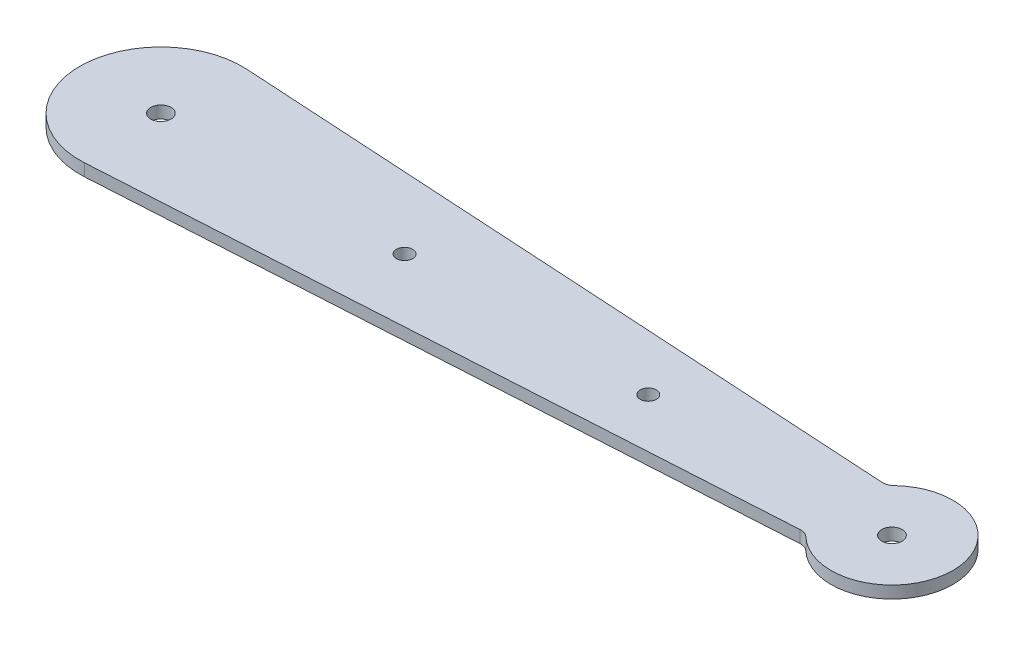
ISO-10303-21;
HEADER;
FILE_DESCRIPTION(('STEP AP214'),'2;1');
FILE_NAME('part.step','',(''),(''),'','','');
FILE_SCHEMA(('AUTOMOTIVE_DESIGN { 1 0 10303 214 1 1 1 1 }'));
ENDSEC;
DATA;
#1=APPLICATION_CONTEXT('core data for automotive mechanical design processes');
#2=APPLICATION_PROTOCOL_DEFINITION('international standard','automotive_design',2000,#1);
#3=PRODUCT_CONTEXT('',#1,'mechanical');
#4=PRODUCT('Part','Part','',(#3));
#5=PRODUCT_RELATED_PRODUCT_CATEGORY('part','',(#4));
#6=PRODUCT_DEFINITION_FORMATION('','',#4);
#7=PRODUCT_DEFINITION_CONTEXT('part definition',#1,'design');
#8=PRODUCT_DEFINITION('design','',#6,#7);
#9=PRODUCT_DEFINITION_SHAPE('','',#8);
#10=(LENGTH_UNIT() NAMED_UNIT(*) SI_UNIT(.MILLI.,.METRE.));
#11=(NAMED_UNIT(*) PLANE_ANGLE_UNIT() SI_UNIT($,.RADIAN.));
#12=(NAMED_UNIT(*) SI_UNIT($,.STERADIAN.) SOLID_ANGLE_UNIT());
#13=UNCERTAINTY_MEASURE_WITH_UNIT(LENGTH_MEASURE(1.E-05),#10,'distance_accuracy_value','');
#14=(GEOMETRIC_REPRESENTATION_CONTEXT(3) GLOBAL_UNCERTAINTY_ASSIGNED_CONTEXT((#13)) GLOBAL_UNIT_ASSIGNED_CONTEXT((#10,
#11,#12)) REPRESENTATION_CONTEXT('',''));
#15=CARTESIAN_POINT('',(0.,0.,0.));
#16=DIRECTION('',(0.,0.,1.));
#17=DIRECTION('',(1.,0.,0.));
#18=AXIS2_PLACEMENT_3D('',#15,#16,#17);
#19=CARTESIAN_POINT('',(167.629963347197,3.,13.076015953199));
#20=DIRECTION('',(0.,-1.,0.));
#21=DIRECTION('',(0.,0.,-1.));
#22=AXIS2_PLACEMENT_3D('',#19,#20,#21);
#23=CYLINDRICAL_SURFACE('',#22,3.);
#24=DIRECTION('',(0.,-1.,0.));
#25=VECTOR('',#24,1.);
#26=CARTESIAN_POINT('',(167.451945789046,3.,10.0813023193118));
#27=LINE('',#26,#25);
#28=CARTESIAN_POINT('',(167.451945789046,0.,10.0813023193118));
#29=VERTEX_POINT('',#28);
#30=CARTESIAN_POINT('',(167.451945789046,3.,10.0813023193118));
#31=VERTEX_POINT('',#30);
#32=EDGE_CURVE('E124',#29,#31,#27,.F.);
#33=ORIENTED_EDGE('',*,*,#32,.F.);
#34=CARTESIAN_POINT('',(167.629963347197,0.,13.076015953199));
#35=DIRECTION('',(0.,1.,0.));
#36=DIRECTION('',(0.,0.,1.));
#37=AXIS2_PLACEMENT_3D('',#34,#35,#36);
#38=CIRCLE('',#37,3.);
#39=CARTESIAN_POINT('',(169.691636122664,0.,10.8966799609992));
#40=VERTEX_POINT('',#39);
#41=EDGE_CURVE('E43',#29,#40,#38,.F.);
#42=ORIENTED_EDGE('',*,*,#41,.T.);
#43=DIRECTION('',(0.,-1.,0.));
#44=VECTOR('',#43,1.);
#45=CARTESIAN_POINT('',(169.691636122664,3.,10.8966799609992));
#46=LINE('',#45,#44);
#47=CARTESIAN_POINT('',(169.691636122664,3.,10.8966799609992));
#48=VERTEX_POINT('',#47);
#49=EDGE_CURVE('E127',#48,#40,#46,.T.);
#50=ORIENTED_EDGE('',*,*,#49,.F.);
#51=CARTESIAN_POINT('',(167.629963347197,3.,13.076015953199));
#52=DIRECTION('',(0.,1.,0.));
#53=DIRECTION('',(0.,0.,1.));
#54=AXIS2_PLACEMENT_3D('',#51,#52,#53);
#55=CIRCLE('',#54,3.);
#56=EDGE_CURVE('E11',#48,#31,#55,.T.);
#57=ORIENTED_EDGE('',*,*,#56,.T.);
#58=EDGE_LOOP('',(#33,#42,#50,#57));
#59=FACE_BOUND('',#58,.T.);
#60=ADVANCED_FACE('F36',(#59),#23,.F.);
#61=CARTESIAN_POINT('',(167.629963347197,3.,-13.076015953199));
#62=DIRECTION('',(0.,-1.,0.));
#63=DIRECTION('',(0.,0.,-1.));
#64=AXIS2_PLACEMENT_3D('',#61,#62,#63);
#65=CYLINDRICAL_SURFACE('',#64,3.);
#66=DIRECTION('',(0.,1.,0.));
#67=VECTOR('',#66,1.);
#68=CARTESIAN_POINT('',(167.451945789046,3.,-10.0813023193118));
#69=LINE('',#68,#67);
#70=CARTESIAN_POINT('',(167.451945789046,3.,-10.0813023193118));
#71=VERTEX_POINT('',#70);
#72=CARTESIAN_POINT('',(167.451945789046,0.,-10.0813023193118));
#73=VERTEX_POINT('',#72);
#74=EDGE_CURVE('E111',#71,#73,#69,.F.);
#75=ORIENTED_EDGE('',*,*,#74,.F.);
#76=CARTESIAN_POINT('',(167.629963347197,3.,-13.076015953199));
#77=DIRECTION('',(0.,1.,0.));
#78=DIRECTION('',(0.,0.,1.));
#79=AXIS2_PLACEMENT_3D('',#76,#77,#78);
#80=CIRCLE('',#79,3.);
#81=CARTESIAN_POINT('',(169.691636122664,3.,-10.8966799609992));
#82=VERTEX_POINT('',#81);
#83=EDGE_CURVE('E91',#71,#82,#80,.T.);
#84=ORIENTED_EDGE('',*,*,#83,.T.);
#85=DIRECTION('',(0.,-1.,0.));
#86=VECTOR('',#85,1.);
#87=CARTESIAN_POINT('',(169.691636122664,3.,-10.8966799609992));
#88=LINE('',#87,#86);
#89=CARTESIAN_POINT('',(169.691636122664,0.,-10.8966799609992));
#90=VERTEX_POINT('',#89);
#91=EDGE_CURVE('E113',#90,#82,#88,.F.);
#92=ORIENTED_EDGE('',*,*,#91,.F.);
#93=CARTESIAN_POINT('',(167.629963347197,0.,-13.076015953199));
#94=DIRECTION('',(0.,1.,0.));
#95=DIRECTION('',(0.,0.,1.));
#96=AXIS2_PLACEMENT_3D('',#93,#94,#95);
#97=CIRCLE('',#96,3.);
#98=EDGE_CURVE('E122',#90,#73,#97,.F.);
#99=ORIENTED_EDGE('',*,*,#98,.T.);
#100=EDGE_LOOP('',(#75,#84,#92,#99));
#101=FACE_BOUND('',#100,.T.);
#102=ADVANCED_FACE('F189',(#101),#65,.F.);
#103=CARTESIAN_POINT('',(-81.2636304353254,3.,24.8659344966924));
#104=DIRECTION('',(0.0593391860503703,0.,0.998237877962402));
#105=DIRECTION('',(0.998237877962402,0.,-0.0593391860503703));
#106=AXIS2_PLACEMENT_3D('',#103,#104,#105);
#107=PLANE('',#106);
#108=DIRECTION('',(-0.998237877962402,0.,0.0593391860503703));
#109=VECTOR('',#108,1.);
#110=CARTESIAN_POINT('',(-81.2636304353254,0.,24.8659344966924));
#111=LINE('',#110,#109);
#112=CARTESIAN_POINT('',(1.1867837210074,0.,19.964757559248));
#113=VERTEX_POINT('',#112);
#114=EDGE_CURVE('E138',#29,#113,#111,.T.);
#115=ORIENTED_EDGE('',*,*,#114,.F.);
#116=ORIENTED_EDGE('',*,*,#32,.T.);
#117=DIRECTION('',(-0.998237877962402,0.,0.0593391860503703));
#118=VECTOR('',#117,1.);
#119=CARTESIAN_POINT('',(-81.2636304353254,3.,24.8659344966924));
#120=LINE('',#119,#118);
#121=CARTESIAN_POINT('',(1.1867837210074,3.,19.964757559248));
#122=VERTEX_POINT('',#121);
#123=EDGE_CURVE('E158',#31,#122,#120,.T.);
#124=ORIENTED_EDGE('',*,*,#123,.T.);
#125=DIRECTION('',(0.,-1.,0.));
#126=VECTOR('',#125,1.);
#127=CARTESIAN_POINT('',(1.1867837210074,3.,19.964757559248));
#128=LINE('',#127,#126);
#129=EDGE_CURVE('E104',#122,#113,#128,.T.);
#130=ORIENTED_EDGE('',*,*,#129,.T.);
#131=EDGE_LOOP('',(#115,#116,#124,#130));
#132=FACE_BOUND('',#131,.T.);
#133=ADVANCED_FACE('F193',(#132),#107,.T.);
#134=CARTESIAN_POINT('',(180.,3.,0.));
#135=DIRECTION('',(0.,-1.,0.));
#136=DIRECTION('',(0.,0.,-1.));
#137=AXIS2_PLACEMENT_3D('',#134,#135,#136);
#138=CYLINDRICAL_SURFACE('',#137,15.);
#139=CARTESIAN_POINT('',(180.,3.,0.));
#140=DIRECTION('',(0.,1.,0.));
#141=DIRECTION('',(0.,0.,1.));
#142=AXIS2_PLACEMENT_3D('',#139,#140,#141);
#143=CIRCLE('',#142,15.);
#144=EDGE_CURVE('E96',#48,#82,#143,.T.);
#145=ORIENTED_EDGE('',*,*,#144,.F.);
#146=ORIENTED_EDGE('',*,*,#49,.T.);
#147=CARTESIAN_POINT('',(180.,0.,0.));
#148=DIRECTION('',(0.,1.,0.));
#149=DIRECTION('',(0.,0.,1.));
#150=AXIS2_PLACEMENT_3D('',#147,#148,#149);
#151=CIRCLE('',#150,15.);
#152=EDGE_CURVE('E132',#40,#90,#151,.T.);
#153=ORIENTED_EDGE('',*,*,#152,.T.);
#154=ORIENTED_EDGE('',*,*,#91,.T.);
#155=EDGE_LOOP('',(#145,#146,#153,#154));
#156=FACE_BOUND('',#155,.T.);
#157=ADVANCED_FACE('F131',(#156),#138,.T.);
#158=CARTESIAN_POINT('',(-81.2636304353254,3.,-24.8659344966924));
#159=DIRECTION('',(-0.0593391860503703,0.,0.998237877962402));
#160=DIRECTION('',(0.998237877962402,0.,0.0593391860503703));
#161=AXIS2_PLACEMENT_3D('',#158,#159,#160);
#162=PLANE('',#161);
#163=DIRECTION('',(-0.998237877962402,0.,-0.0593391860503703));
#164=VECTOR('',#163,1.);
#165=CARTESIAN_POINT('',(-81.2636304353254,3.,-24.8659344966924));
#166=LINE('',#165,#164);
#167=CARTESIAN_POINT('',(1.1867837210074,3.,-19.964757559248));
#168=VERTEX_POINT('',#167);
#169=EDGE_CURVE('E84',#71,#168,#166,.T.);
#170=ORIENTED_EDGE('',*,*,#169,.F.);
#171=ORIENTED_EDGE('',*,*,#74,.T.);
#172=DIRECTION('',(-0.998237877962402,0.,-0.0593391860503703));
#173=VECTOR('',#172,1.);
#174=CARTESIAN_POINT('',(-81.2636304353254,0.,-24.8659344966924));
#175=LINE('',#174,#173);
#176=CARTESIAN_POINT('',(1.1867837210074,0.,-19.964757559248));
#177=VERTEX_POINT('',#176);
#178=EDGE_CURVE('E109',#73,#177,#175,.T.);
#179=ORIENTED_EDGE('',*,*,#178,.T.);
#180=DIRECTION('',(0.,-1.,0.));
#181=VECTOR('',#180,1.);
#182=CARTESIAN_POINT('',(1.1867837210074,3.,-19.964757559248));
#183=LINE('',#182,#181);
#184=EDGE_CURVE('E102',#168,#177,#183,.T.);
#185=ORIENTED_EDGE('',*,*,#184,.F.);
#186=EDGE_LOOP('',(#170,#171,#179,#185));
#187=FACE_BOUND('',#186,.T.);
#188=ADVANCED_FACE('F107',(#187),#162,.F.);
#189=CARTESIAN_POINT('',(0.,3.,0.));
#190=DIRECTION('',(0.,-1.,0.));
#191=DIRECTION('',(0.,0.,-1.));
#192=AXIS2_PLACEMENT_3D('',#189,#190,#191);
#193=CYLINDRICAL_SURFACE('',#192,2.5);
#194=CARTESIAN_POINT('',(0.,3.,0.));
#195=DIRECTION('',(0.,1.,0.));
#196=DIRECTION('',(0.,0.,1.));
#197=AXIS2_PLACEMENT_3D('',#194,#195,#196);
#198=CIRCLE('',#197,2.5);
#199=CARTESIAN_POINT('',(0.,3.,2.5));
#200=VERTEX_POINT('',#199);
#201=EDGE_CURVE('E167',#200,#200,#198,.T.);
#202=ORIENTED_EDGE('',*,*,#201,.T.);
#203=EDGE_LOOP('',(#202));
#204=FACE_BOUND('',#203,.T.);
#205=CARTESIAN_POINT('',(0.,0.,0.));
#206=DIRECTION('',(0.,1.,0.));
#207=DIRECTION('',(0.,0.,1.));
#208=AXIS2_PLACEMENT_3D('',#205,#206,#207);
#209=CIRCLE('',#208,2.5);
#210=CARTESIAN_POINT('',(0.,0.,2.5));
#211=VERTEX_POINT('',#210);
#212=EDGE_CURVE('E150',#211,#211,#209,.T.);
#213=ORIENTED_EDGE('',*,*,#212,.F.);
#214=EDGE_LOOP('',(#213));
#215=FACE_BOUND('',#214,.T.);
#216=ADVANCED_FACE('F204',(#204,#215),#193,.F.);
#217=CARTESIAN_POINT('',(120.,3.,0.));
#218=DIRECTION('',(0.,-1.,0.));
#219=DIRECTION('',(0.,0.,-1.));
#220=AXIS2_PLACEMENT_3D('',#217,#218,#219);
#221=CYLINDRICAL_SURFACE('',#220,2.);
#222=CARTESIAN_POINT('',(120.,3.,0.));
#223=DIRECTION('',(0.,1.,0.));
#224=DIRECTION('',(0.,0.,1.));
#225=AXIS2_PLACEMENT_3D('',#222,#223,#224);
#226=CIRCLE('',#225,2.);
#227=CARTESIAN_POINT('',(120.,3.,2.));
#228=VERTEX_POINT('',#227);
#229=EDGE_CURVE('E105',#228,#228,#226,.T.);
#230=ORIENTED_EDGE('',*,*,#229,.T.);
#231=EDGE_LOOP('',(#230));
#232=FACE_BOUND('',#231,.T.);
#233=CARTESIAN_POINT('',(120.,0.,0.));
#234=DIRECTION('',(0.,1.,0.));
#235=DIRECTION('',(0.,0.,1.));
#236=AXIS2_PLACEMENT_3D('',#233,#234,#235);
#237=CIRCLE('',#236,2.);
#238=CARTESIAN_POINT('',(120.,0.,2.));
#239=VERTEX_POINT('',#238);
#240=EDGE_CURVE('E147',#239,#239,#237,.T.);
#241=ORIENTED_EDGE('',*,*,#240,.F.);
#242=EDGE_LOOP('',(#241));
#243=FACE_BOUND('',#242,.T.);
#244=ADVANCED_FACE('F185',(#232,#243),#221,.F.);
#245=CARTESIAN_POINT('',(0.,3.,0.));
#246=DIRECTION('',(0.,-1.,0.));
#247=DIRECTION('',(0.,0.,-1.));
#248=AXIS2_PLACEMENT_3D('',#245,#246,#247);
#249=CYLINDRICAL_SURFACE('',#248,20.);
#250=CARTESIAN_POINT('',(0.,0.,0.));
#251=DIRECTION('',(0.,1.,0.));
#252=DIRECTION('',(0.,0.,1.));
#253=AXIS2_PLACEMENT_3D('',#250,#251,#252);
#254=CIRCLE('',#253,20.);
#255=EDGE_CURVE('E140',#177,#113,#254,.T.);
#256=ORIENTED_EDGE('',*,*,#255,.T.);
#257=ORIENTED_EDGE('',*,*,#129,.F.);
#258=CARTESIAN_POINT('',(0.,3.,0.));
#259=DIRECTION('',(0.,1.,0.));
#260=DIRECTION('',(0.,0.,1.));
#261=AXIS2_PLACEMENT_3D('',#258,#259,#260);
#262=CIRCLE('',#261,20.);
#263=EDGE_CURVE('E88',#168,#122,#262,.T.);
#264=ORIENTED_EDGE('',*,*,#263,.F.);
#265=ORIENTED_EDGE('',*,*,#184,.T.);
#266=EDGE_LOOP('',(#256,#257,#264,#265));
#267=FACE_BOUND('',#266,.T.);
#268=ADVANCED_FACE('F101',(#267),#249,.T.);
#269=CARTESIAN_POINT('',(60.,3.,0.));
#270=DIRECTION('',(0.,-1.,0.));
#271=DIRECTION('',(0.,0.,-1.));
#272=AXIS2_PLACEMENT_3D('',#269,#270,#271);
#273=CYLINDRICAL_SURFACE('',#272,2.);
#274=CARTESIAN_POINT('',(60.,3.,0.));
#275=DIRECTION('',(0.,1.,0.));
#276=DIRECTION('',(0.,0.,1.));
#277=AXIS2_PLACEMENT_3D('',#274,#275,#276);
#278=CIRCLE('',#277,2.);
#279=CARTESIAN_POINT('',(60.,3.,2.));
#280=VERTEX_POINT('',#279);
#281=EDGE_CURVE('E154',#280,#280,#278,.T.);
#282=ORIENTED_EDGE('',*,*,#281,.T.);
#283=EDGE_LOOP('',(#282));
#284=FACE_BOUND('',#283,.T.);
#285=CARTESIAN_POINT('',(60.,0.,0.));
#286=DIRECTION('',(0.,1.,0.));
#287=DIRECTION('',(0.,0.,1.));
#288=AXIS2_PLACEMENT_3D('',#285,#286,#287);
#289=CIRCLE('',#288,2.);
#290=CARTESIAN_POINT('',(60.,0.,2.));
#291=VERTEX_POINT('',#290);
#292=EDGE_CURVE('E142',#291,#291,#289,.T.);
#293=ORIENTED_EDGE('',*,*,#292,.F.);
#294=EDGE_LOOP('',(#293));
#295=FACE_BOUND('',#294,.T.);
#296=ADVANCED_FACE('F175',(#284,#295),#273,.F.);
#297=CARTESIAN_POINT('',(180.,3.,0.));
#298=DIRECTION('',(0.,-1.,0.));
#299=DIRECTION('',(0.,0.,-1.));
#300=AXIS2_PLACEMENT_3D('',#297,#298,#299);
#301=CYLINDRICAL_SURFACE('',#300,2.5);
#302=CARTESIAN_POINT('',(180.,3.,0.));
#303=DIRECTION('',(0.,1.,0.));
#304=DIRECTION('',(0.,0.,1.));
#305=AXIS2_PLACEMENT_3D('',#302,#303,#304);
#306=CIRCLE('',#305,2.5);
#307=CARTESIAN_POINT('',(180.,3.,2.5));
#308=VERTEX_POINT('',#307);
#309=EDGE_CURVE('E115',#308,#308,#306,.T.);
#310=ORIENTED_EDGE('',*,*,#309,.T.);
#311=EDGE_LOOP('',(#310));
#312=FACE_BOUND('',#311,.T.);
#313=CARTESIAN_POINT('',(180.,0.,0.));
#314=DIRECTION('',(0.,1.,0.));
#315=DIRECTION('',(0.,0.,1.));
#316=AXIS2_PLACEMENT_3D('',#313,#314,#315);
#317=CIRCLE('',#316,2.5);
#318=CARTESIAN_POINT('',(180.,0.,2.5));
#319=VERTEX_POINT('',#318);
#320=EDGE_CURVE('E152',#319,#319,#317,.T.);
#321=ORIENTED_EDGE('',*,*,#320,.F.);
#322=EDGE_LOOP('',(#321));
#323=FACE_BOUND('',#322,.T.);
#324=ADVANCED_FACE('F177',(#312,#323),#301,.F.);
#325=CARTESIAN_POINT('',(-82.7417593923505,3.,0.));
#326=DIRECTION('',(0.,1.,0.));
#327=DIRECTION('',(0.,0.,1.));
#328=AXIS2_PLACEMENT_3D('',#325,#326,#327);
#329=PLANE('',#328);
#330=ORIENTED_EDGE('',*,*,#56,.F.);
#331=ORIENTED_EDGE('',*,*,#144,.T.);
#332=ORIENTED_EDGE('',*,*,#83,.F.);
#333=ORIENTED_EDGE('',*,*,#169,.T.);
#334=ORIENTED_EDGE('',*,*,#263,.T.);
#335=ORIENTED_EDGE('',*,*,#123,.F.);
#336=EDGE_LOOP('',(#330,#331,#332,#333,#334,#335));
#337=FACE_BOUND('',#336,.T.);
#338=ORIENTED_EDGE('',*,*,#281,.F.);
#339=EDGE_LOOP('',(#338));
#340=FACE_BOUND('',#339,.T.);
#341=ORIENTED_EDGE('',*,*,#229,.F.);
#342=EDGE_LOOP('',(#341));
#343=FACE_BOUND('',#342,.T.);
#344=ORIENTED_EDGE('',*,*,#201,.F.);
#345=EDGE_LOOP('',(#344));
#346=FACE_BOUND('',#345,.T.);
#347=ORIENTED_EDGE('',*,*,#309,.F.);
#348=EDGE_LOOP('',(#347));
#349=FACE_BOUND('',#348,.T.);
#350=ADVANCED_FACE('F86',(#337,#340,#343,#346,#349),#329,.T.);
#351=CARTESIAN_POINT('',(-82.7417593923505,0.,0.));
#352=DIRECTION('',(0.,1.,0.));
#353=DIRECTION('',(0.,0.,1.));
#354=AXIS2_PLACEMENT_3D('',#351,#352,#353);
#355=PLANE('',#354);
#356=ORIENTED_EDGE('',*,*,#41,.F.);
#357=ORIENTED_EDGE('',*,*,#114,.T.);
#358=ORIENTED_EDGE('',*,*,#255,.F.);
#359=ORIENTED_EDGE('',*,*,#178,.F.);
#360=ORIENTED_EDGE('',*,*,#98,.F.);
#361=ORIENTED_EDGE('',*,*,#152,.F.);
#362=EDGE_LOOP('',(#356,#357,#358,#359,#360,#361));
#363=FACE_BOUND('',#362,.T.);
#364=ORIENTED_EDGE('',*,*,#292,.T.);
#365=EDGE_LOOP('',(#364));
#366=FACE_BOUND('',#365,.T.);
#367=ORIENTED_EDGE('',*,*,#240,.T.);
#368=EDGE_LOOP('',(#367));
#369=FACE_BOUND('',#368,.T.);
#370=ORIENTED_EDGE('',*,*,#212,.T.);
#371=EDGE_LOOP('',(#370));
#372=FACE_BOUND('',#371,.T.);
#373=ORIENTED_EDGE('',*,*,#320,.T.);
#374=EDGE_LOOP('',(#373));
#375=FACE_BOUND('',#374,.T.);
#376=ADVANCED_FACE('F135',(#363,#366,#369,#372,#375),#355,.F.);
#377=CLOSED_SHELL('',(#60,#102,#133,#157,#188,#216,#244,#268,#296,#324,#350,#376));
#378=MANIFOLD_SOLID_BREP('B2',#377);
#379=ADVANCED_BREP_SHAPE_REPRESENTATION('',(#18,#378),#14);
#380=SHAPE_DEFINITION_REPRESENTATION(#9,#379);
ENDSEC;
END-ISO-10303-21;
